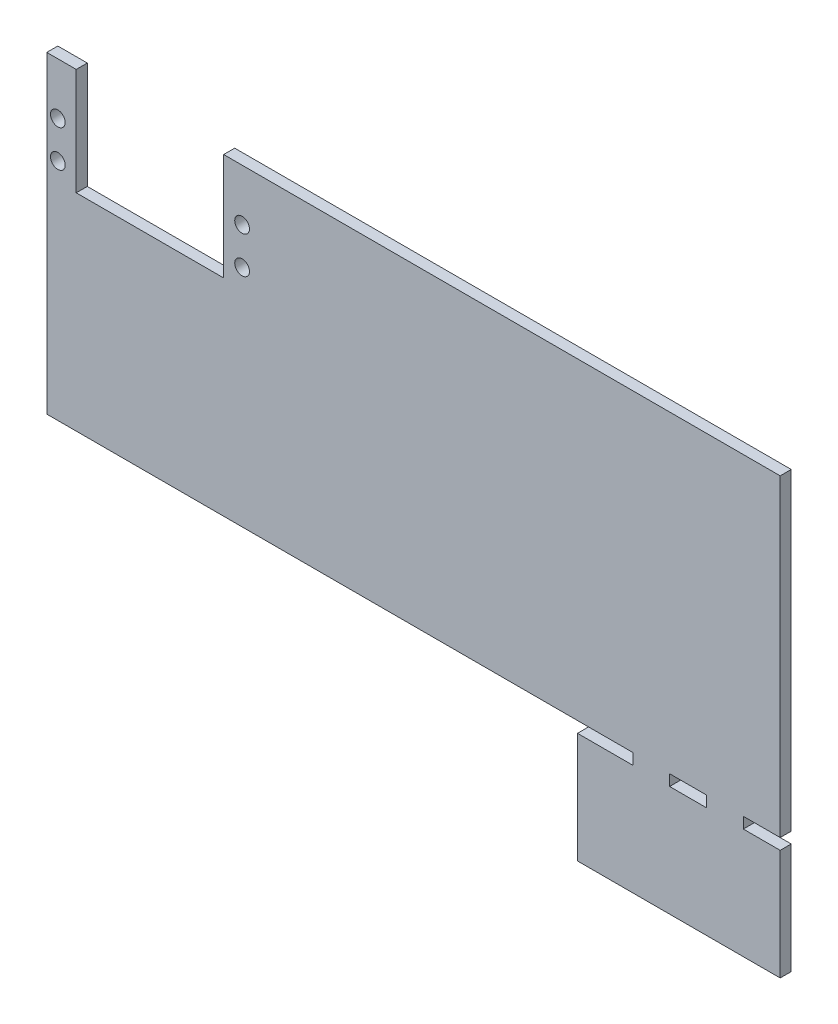
ISO-10303-21;
HEADER;
FILE_DESCRIPTION(('STEP AP214'),'2;1');
FILE_NAME('part.step','',(''),(''),'','','');
FILE_SCHEMA(('AUTOMOTIVE_DESIGN { 1 0 10303 214 1 1 1 1 }'));
ENDSEC;
DATA;
#1=APPLICATION_CONTEXT('core data for automotive mechanical design processes');
#2=APPLICATION_PROTOCOL_DEFINITION('international standard','automotive_design',2000,#1);
#3=PRODUCT_CONTEXT('',#1,'mechanical');
#4=PRODUCT('Part','Part','',(#3));
#5=PRODUCT_RELATED_PRODUCT_CATEGORY('part','',(#4));
#6=PRODUCT_DEFINITION_FORMATION('','',#4);
#7=PRODUCT_DEFINITION_CONTEXT('part definition',#1,'design');
#8=PRODUCT_DEFINITION('design','',#6,#7);
#9=PRODUCT_DEFINITION_SHAPE('','',#8);
#10=(LENGTH_UNIT() NAMED_UNIT(*) SI_UNIT(.MILLI.,.METRE.));
#11=(NAMED_UNIT(*) PLANE_ANGLE_UNIT() SI_UNIT($,.RADIAN.));
#12=(NAMED_UNIT(*) SI_UNIT($,.STERADIAN.) SOLID_ANGLE_UNIT());
#13=UNCERTAINTY_MEASURE_WITH_UNIT(LENGTH_MEASURE(1.E-05),#10,'distance_accuracy_value','');
#14=(GEOMETRIC_REPRESENTATION_CONTEXT(3) GLOBAL_UNCERTAINTY_ASSIGNED_CONTEXT((#13)) GLOBAL_UNIT_ASSIGNED_CONTEXT((#10,
#11,#12)) REPRESENTATION_CONTEXT('',''));
#15=CARTESIAN_POINT('',(0.,0.,0.));
#16=DIRECTION('',(0.,0.,1.));
#17=DIRECTION('',(1.,0.,0.));
#18=AXIS2_PLACEMENT_3D('',#15,#16,#17);
#19=CARTESIAN_POINT('',(27.5,60.5,3.));
#20=DIRECTION('',(0.,1.,0.));
#21=DIRECTION('',(0.,0.,1.));
#22=AXIS2_PLACEMENT_3D('',#19,#20,#21);
#23=PLANE('',#22);
#24=DIRECTION('',(0.,0.,-1.));
#25=VECTOR('',#24,1.);
#26=CARTESIAN_POINT('',(-123.5,60.5,33.));
#27=LINE('',#26,#25);
#28=CARTESIAN_POINT('',(-123.5,60.5,3.));
#29=VERTEX_POINT('',#28);
#30=CARTESIAN_POINT('',(-123.5,60.5,0.));
#31=VERTEX_POINT('',#30);
#32=EDGE_CURVE('E188',#29,#31,#27,.T.);
#33=ORIENTED_EDGE('',*,*,#32,.F.);
#34=DIRECTION('',(1.,0.,0.));
#35=VECTOR('',#34,1.);
#36=CARTESIAN_POINT('',(27.5,60.5,3.));
#37=LINE('',#36,#35);
#38=CARTESIAN_POINT('',(27.5,60.5,3.));
#39=VERTEX_POINT('',#38);
#40=EDGE_CURVE('E195',#29,#39,#37,.T.);
#41=ORIENTED_EDGE('',*,*,#40,.T.);
#42=DIRECTION('',(0.,0.,-1.));
#43=VECTOR('',#42,1.);
#44=CARTESIAN_POINT('',(27.5,60.5,3.));
#45=LINE('',#44,#43);
#46=CARTESIAN_POINT('',(27.5,60.5,0.));
#47=VERTEX_POINT('',#46);
#48=EDGE_CURVE('E202',#39,#47,#45,.T.);
#49=ORIENTED_EDGE('',*,*,#48,.T.);
#50=DIRECTION('',(1.,0.,0.));
#51=VECTOR('',#50,1.);
#52=CARTESIAN_POINT('',(27.5,60.5,0.));
#53=LINE('',#52,#51);
#54=EDGE_CURVE('E196',#31,#47,#53,.T.);
#55=ORIENTED_EDGE('',*,*,#54,.F.);
#56=EDGE_LOOP('',(#33,#41,#49,#55));
#57=FACE_BOUND('',#56,.T.);
#58=ADVANCED_FACE('F33',(#57),#23,.T.);
#59=CARTESIAN_POINT('',(0.,0.,3.));
#60=DIRECTION('',(0.,0.,-1.));
#61=DIRECTION('',(-1.,0.,0.));
#62=AXIS2_PLACEMENT_3D('',#59,#60,#61);
#63=PLANE('',#62);
#64=CARTESIAN_POINT('',(-118.5,36.5,3.));
#65=DIRECTION('',(0.,0.,-1.));
#66=DIRECTION('',(-1.,0.,0.));
#67=AXIS2_PLACEMENT_3D('',#64,#65,#66);
#68=CIRCLE('',#67,2.);
#69=CARTESIAN_POINT('',(-120.5,36.5,3.));
#70=VERTEX_POINT('',#69);
#71=EDGE_CURVE('E426',#70,#70,#68,.T.);
#72=ORIENTED_EDGE('',*,*,#71,.T.);
#73=EDGE_LOOP('',(#72));
#74=FACE_BOUND('',#73,.T.);
#75=CARTESIAN_POINT('',(-168.5,46.5,3.));
#76=DIRECTION('',(0.,0.,-1.));
#77=DIRECTION('',(-1.,0.,0.));
#78=AXIS2_PLACEMENT_3D('',#75,#76,#77);
#79=CIRCLE('',#78,2.);
#80=CARTESIAN_POINT('',(-170.5,46.5,3.));
#81=VERTEX_POINT('',#80);
#82=EDGE_CURVE('E420',#81,#81,#79,.T.);
#83=ORIENTED_EDGE('',*,*,#82,.T.);
#84=EDGE_LOOP('',(#83));
#85=FACE_BOUND('',#84,.T.);
#86=ORIENTED_EDGE('',*,*,#40,.F.);
#87=DIRECTION('',(0.,-1.,0.));
#88=VECTOR('',#87,1.);
#89=CARTESIAN_POINT('',(-123.5,0.,3.));
#90=LINE('',#89,#88);
#91=CARTESIAN_POINT('',(-123.5,31.5,3.));
#92=VERTEX_POINT('',#91);
#93=EDGE_CURVE('E412',#29,#92,#90,.T.);
#94=ORIENTED_EDGE('',*,*,#93,.T.);
#95=DIRECTION('',(-1.,0.,0.));
#96=VECTOR('',#95,1.);
#97=CARTESIAN_POINT('',(0.,31.5,3.));
#98=LINE('',#97,#96);
#99=CARTESIAN_POINT('',(-163.5,31.5,3.));
#100=VERTEX_POINT('',#99);
#101=EDGE_CURVE('E411',#92,#100,#98,.T.);
#102=ORIENTED_EDGE('',*,*,#101,.T.);
#103=DIRECTION('',(0.,-1.,0.));
#104=VECTOR('',#103,1.);
#105=CARTESIAN_POINT('',(-163.5,0.,3.));
#106=LINE('',#105,#104);
#107=CARTESIAN_POINT('',(-163.5,60.5,3.));
#108=VERTEX_POINT('',#107);
#109=EDGE_CURVE('E409',#108,#100,#106,.T.);
#110=ORIENTED_EDGE('',*,*,#109,.F.);
#111=CARTESIAN_POINT('',(-171.5,60.5,3.));
#112=VERTEX_POINT('',#111);
#113=EDGE_CURVE('E187',#112,#108,#37,.T.);
#114=ORIENTED_EDGE('',*,*,#113,.F.);
#115=DIRECTION('',(0.,1.,0.));
#116=VECTOR('',#115,1.);
#117=CARTESIAN_POINT('',(-171.5,-24.5,3.));
#118=LINE('',#117,#116);
#119=CARTESIAN_POINT('',(-171.5,-24.5,3.));
#120=VERTEX_POINT('',#119);
#121=EDGE_CURVE('E207',#120,#112,#118,.T.);
#122=ORIENTED_EDGE('',*,*,#121,.F.);
#123=DIRECTION('',(-1.,0.,0.));
#124=VECTOR('',#123,1.);
#125=CARTESIAN_POINT('',(-12.5,-24.5,3.));
#126=LINE('',#125,#124);
#127=CARTESIAN_POINT('',(-12.5,-24.5,3.));
#128=VERTEX_POINT('',#127);
#129=EDGE_CURVE('E255',#128,#120,#126,.T.);
#130=ORIENTED_EDGE('',*,*,#129,.F.);
#131=DIRECTION('',(0.,-1.,0.));
#132=VECTOR('',#131,1.);
#133=CARTESIAN_POINT('',(-12.5,-24.5,3.));
#134=LINE('',#133,#132);
#135=CARTESIAN_POINT('',(-12.5,-27.5,3.));
#136=VERTEX_POINT('',#135);
#137=EDGE_CURVE('E251',#128,#136,#134,.T.);
#138=ORIENTED_EDGE('',*,*,#137,.T.);
#139=DIRECTION('',(1.,0.,0.));
#140=VECTOR('',#139,1.);
#141=CARTESIAN_POINT('',(-27.5,-27.5,3.));
#142=LINE('',#141,#140);
#143=CARTESIAN_POINT('',(-27.5,-27.5,3.));
#144=VERTEX_POINT('',#143);
#145=EDGE_CURVE('E218',#144,#136,#142,.T.);
#146=ORIENTED_EDGE('',*,*,#145,.F.);
#147=DIRECTION('',(0.,1.,0.));
#148=VECTOR('',#147,1.);
#149=CARTESIAN_POINT('',(-27.5,-57.5,3.));
#150=LINE('',#149,#148);
#151=CARTESIAN_POINT('',(-27.5,-57.5,3.));
#152=VERTEX_POINT('',#151);
#153=EDGE_CURVE('E213',#152,#144,#150,.T.);
#154=ORIENTED_EDGE('',*,*,#153,.F.);
#155=DIRECTION('',(-1.,0.,0.));
#156=VECTOR('',#155,1.);
#157=CARTESIAN_POINT('',(-27.5,-57.5,3.));
#158=LINE('',#157,#156);
#159=CARTESIAN_POINT('',(27.5,-57.5,3.));
#160=VERTEX_POINT('',#159);
#161=EDGE_CURVE('E224',#160,#152,#158,.T.);
#162=ORIENTED_EDGE('',*,*,#161,.F.);
#163=DIRECTION('',(0.,-1.,0.));
#164=VECTOR('',#163,1.);
#165=CARTESIAN_POINT('',(27.5,-57.5,3.));
#166=LINE('',#165,#164);
#167=CARTESIAN_POINT('',(27.5,-27.5,3.));
#168=VERTEX_POINT('',#167);
#169=EDGE_CURVE('E220',#168,#160,#166,.T.);
#170=ORIENTED_EDGE('',*,*,#169,.F.);
#171=CARTESIAN_POINT('',(17.5,-27.5,3.));
#172=VERTEX_POINT('',#171);
#173=EDGE_CURVE('E216',#172,#168,#142,.T.);
#174=ORIENTED_EDGE('',*,*,#173,.F.);
#175=DIRECTION('',(0.,-1.,0.));
#176=VECTOR('',#175,1.);
#177=CARTESIAN_POINT('',(17.5,-24.5,3.));
#178=LINE('',#177,#176);
#179=CARTESIAN_POINT('',(17.5,-24.5,3.));
#180=VERTEX_POINT('',#179);
#181=EDGE_CURVE('E267',#180,#172,#178,.T.);
#182=ORIENTED_EDGE('',*,*,#181,.F.);
#183=DIRECTION('',(-1.,0.,0.));
#184=VECTOR('',#183,1.);
#185=CARTESIAN_POINT('',(27.5,-24.5,3.));
#186=LINE('',#185,#184);
#187=CARTESIAN_POINT('',(27.5,-24.5,3.));
#188=VERTEX_POINT('',#187);
#189=EDGE_CURVE('E297',#188,#180,#186,.T.);
#190=ORIENTED_EDGE('',*,*,#189,.F.);
#191=DIRECTION('',(0.,1.,0.));
#192=VECTOR('',#191,1.);
#193=CARTESIAN_POINT('',(27.5,-27.5,3.));
#194=LINE('',#193,#192);
#195=EDGE_CURVE('E11',#188,#39,#194,.T.);
#196=ORIENTED_EDGE('',*,*,#195,.T.);
#197=EDGE_LOOP('',(#86,#94,#102,#110,#114,#122,#130,#138,#146,#154,#162,#170,#174,#182,#190,#196));
#198=FACE_BOUND('',#197,.T.);
#199=CARTESIAN_POINT('',(-2.50000000000001,-27.5,3.));
#200=VERTEX_POINT('',#199);
#201=CARTESIAN_POINT('',(7.49999999999999,-27.5,3.));
#202=VERTEX_POINT('',#201);
#203=EDGE_CURVE('E221',#200,#202,#142,.T.);
#204=ORIENTED_EDGE('',*,*,#203,.F.);
#205=DIRECTION('',(0.,-1.,0.));
#206=VECTOR('',#205,1.);
#207=CARTESIAN_POINT('',(-2.50000000000001,-24.5,3.));
#208=LINE('',#207,#206);
#209=CARTESIAN_POINT('',(-2.50000000000001,-24.5,3.));
#210=VERTEX_POINT('',#209);
#211=EDGE_CURVE('E257',#210,#200,#208,.T.);
#212=ORIENTED_EDGE('',*,*,#211,.F.);
#213=DIRECTION('',(-1.,0.,0.));
#214=VECTOR('',#213,1.);
#215=CARTESIAN_POINT('',(7.49999999999999,-24.5,3.));
#216=LINE('',#215,#214);
#217=CARTESIAN_POINT('',(7.49999999999999,-24.5,3.));
#218=VERTEX_POINT('',#217);
#219=EDGE_CURVE('E278',#218,#210,#216,.T.);
#220=ORIENTED_EDGE('',*,*,#219,.F.);
#221=DIRECTION('',(0.,-1.,0.));
#222=VECTOR('',#221,1.);
#223=CARTESIAN_POINT('',(7.49999999999999,-24.5,3.));
#224=LINE('',#223,#222);
#225=EDGE_CURVE('E275',#218,#202,#224,.T.);
#226=ORIENTED_EDGE('',*,*,#225,.T.);
#227=EDGE_LOOP('',(#204,#212,#220,#226));
#228=FACE_BOUND('',#227,.T.);
#229=CARTESIAN_POINT('',(-168.5,36.5,3.));
#230=DIRECTION('',(0.,0.,-1.));
#231=DIRECTION('',(-1.,0.,0.));
#232=AXIS2_PLACEMENT_3D('',#229,#230,#231);
#233=CIRCLE('',#232,2.);
#234=CARTESIAN_POINT('',(-170.5,36.5,3.));
#235=VERTEX_POINT('',#234);
#236=EDGE_CURVE('E423',#235,#235,#233,.F.);
#237=ORIENTED_EDGE('',*,*,#236,.F.);
#238=EDGE_LOOP('',(#237));
#239=FACE_BOUND('',#238,.T.);
#240=CARTESIAN_POINT('',(-118.5,46.5,3.));
#241=DIRECTION('',(0.,0.,-1.));
#242=DIRECTION('',(-1.,0.,0.));
#243=AXIS2_PLACEMENT_3D('',#240,#241,#242);
#244=CIRCLE('',#243,2.);
#245=CARTESIAN_POINT('',(-120.5,46.5,3.));
#246=VERTEX_POINT('',#245);
#247=EDGE_CURVE('E199',#246,#246,#244,.F.);
#248=ORIENTED_EDGE('',*,*,#247,.F.);
#249=EDGE_LOOP('',(#248));
#250=FACE_BOUND('',#249,.T.);
#251=ADVANCED_FACE('F320',(#74,#85,#198,#228,#239,#250),#63,.F.);
#252=CARTESIAN_POINT('',(0.,0.,0.));
#253=DIRECTION('',(0.,0.,-1.));
#254=DIRECTION('',(-1.,0.,0.));
#255=AXIS2_PLACEMENT_3D('',#252,#253,#254);
#256=PLANE('',#255);
#257=DIRECTION('',(0.,-1.,0.));
#258=VECTOR('',#257,1.);
#259=CARTESIAN_POINT('',(-123.5,51.5,0.));
#260=LINE('',#259,#258);
#261=CARTESIAN_POINT('',(-123.5,31.5,0.));
#262=VERTEX_POINT('',#261);
#263=EDGE_CURVE('E179',#31,#262,#260,.T.);
#264=ORIENTED_EDGE('',*,*,#263,.F.);
#265=ORIENTED_EDGE('',*,*,#54,.T.);
#266=DIRECTION('',(0.,1.,0.));
#267=VECTOR('',#266,1.);
#268=CARTESIAN_POINT('',(27.5,-27.5,0.));
#269=LINE('',#268,#267);
#270=CARTESIAN_POINT('',(27.5,-24.5,0.));
#271=VERTEX_POINT('',#270);
#272=EDGE_CURVE('E37',#271,#47,#269,.T.);
#273=ORIENTED_EDGE('',*,*,#272,.F.);
#274=DIRECTION('',(-1.,0.,0.));
#275=VECTOR('',#274,1.);
#276=CARTESIAN_POINT('',(27.5,-24.5,0.));
#277=LINE('',#276,#275);
#278=CARTESIAN_POINT('',(17.5,-24.5,0.));
#279=VERTEX_POINT('',#278);
#280=EDGE_CURVE('E296',#271,#279,#277,.T.);
#281=ORIENTED_EDGE('',*,*,#280,.T.);
#282=DIRECTION('',(0.,-1.,0.));
#283=VECTOR('',#282,1.);
#284=CARTESIAN_POINT('',(17.5,-24.5,0.));
#285=LINE('',#284,#283);
#286=CARTESIAN_POINT('',(17.5,-27.5,0.));
#287=VERTEX_POINT('',#286);
#288=EDGE_CURVE('E300',#279,#287,#285,.T.);
#289=ORIENTED_EDGE('',*,*,#288,.T.);
#290=DIRECTION('',(1.,0.,0.));
#291=VECTOR('',#290,1.);
#292=CARTESIAN_POINT('',(-27.5,-27.5,0.));
#293=LINE('',#292,#291);
#294=CARTESIAN_POINT('',(27.5,-27.5,0.));
#295=VERTEX_POINT('',#294);
#296=EDGE_CURVE('E230',#287,#295,#293,.T.);
#297=ORIENTED_EDGE('',*,*,#296,.T.);
#298=DIRECTION('',(0.,-1.,0.));
#299=VECTOR('',#298,1.);
#300=CARTESIAN_POINT('',(27.5,-57.5,0.));
#301=LINE('',#300,#299);
#302=CARTESIAN_POINT('',(27.5,-57.5,0.));
#303=VERTEX_POINT('',#302);
#304=EDGE_CURVE('E234',#295,#303,#301,.T.);
#305=ORIENTED_EDGE('',*,*,#304,.T.);
#306=DIRECTION('',(-1.,0.,0.));
#307=VECTOR('',#306,1.);
#308=CARTESIAN_POINT('',(-27.5,-57.5,0.));
#309=LINE('',#308,#307);
#310=CARTESIAN_POINT('',(-27.5,-57.5,0.));
#311=VERTEX_POINT('',#310);
#312=EDGE_CURVE('E217',#303,#311,#309,.T.);
#313=ORIENTED_EDGE('',*,*,#312,.T.);
#314=DIRECTION('',(0.,1.,0.));
#315=VECTOR('',#314,1.);
#316=CARTESIAN_POINT('',(-27.5,-57.5,0.));
#317=LINE('',#316,#315);
#318=CARTESIAN_POINT('',(-27.5,-27.5,0.));
#319=VERTEX_POINT('',#318);
#320=EDGE_CURVE('E212',#311,#319,#317,.T.);
#321=ORIENTED_EDGE('',*,*,#320,.T.);
#322=CARTESIAN_POINT('',(-12.5,-27.5,0.));
#323=VERTEX_POINT('',#322);
#324=EDGE_CURVE('E231',#319,#323,#293,.T.);
#325=ORIENTED_EDGE('',*,*,#324,.T.);
#326=DIRECTION('',(0.,-1.,0.));
#327=VECTOR('',#326,1.);
#328=CARTESIAN_POINT('',(-12.5,-24.5,0.));
#329=LINE('',#328,#327);
#330=CARTESIAN_POINT('',(-12.5,-24.5,0.));
#331=VERTEX_POINT('',#330);
#332=EDGE_CURVE('E250',#331,#323,#329,.T.);
#333=ORIENTED_EDGE('',*,*,#332,.F.);
#334=DIRECTION('',(-1.,0.,0.));
#335=VECTOR('',#334,1.);
#336=CARTESIAN_POINT('',(-12.5,-24.5,0.));
#337=LINE('',#336,#335);
#338=CARTESIAN_POINT('',(-171.5,-24.5,0.));
#339=VERTEX_POINT('',#338);
#340=EDGE_CURVE('E56',#331,#339,#337,.T.);
#341=ORIENTED_EDGE('',*,*,#340,.T.);
#342=DIRECTION('',(0.,1.,0.));
#343=VECTOR('',#342,1.);
#344=CARTESIAN_POINT('',(-171.5,-24.5,0.));
#345=LINE('',#344,#343);
#346=CARTESIAN_POINT('',(-171.5,60.5,0.));
#347=VERTEX_POINT('',#346);
#348=EDGE_CURVE('E193',#339,#347,#345,.T.);
#349=ORIENTED_EDGE('',*,*,#348,.T.);
#350=CARTESIAN_POINT('',(-163.5,60.5,0.));
#351=VERTEX_POINT('',#350);
#352=EDGE_CURVE('E185',#347,#351,#53,.T.);
#353=ORIENTED_EDGE('',*,*,#352,.T.);
#354=DIRECTION('',(0.,-1.,0.));
#355=VECTOR('',#354,1.);
#356=CARTESIAN_POINT('',(-163.5,51.5,0.));
#357=LINE('',#356,#355);
#358=CARTESIAN_POINT('',(-163.5,31.5,0.));
#359=VERTEX_POINT('',#358);
#360=EDGE_CURVE('E171',#351,#359,#357,.T.);
#361=ORIENTED_EDGE('',*,*,#360,.T.);
#362=DIRECTION('',(-1.,0.,0.));
#363=VECTOR('',#362,1.);
#364=CARTESIAN_POINT('',(-123.5,31.5,0.));
#365=LINE('',#364,#363);
#366=EDGE_CURVE('E48',#262,#359,#365,.T.);
#367=ORIENTED_EDGE('',*,*,#366,.F.);
#368=EDGE_LOOP('',(#264,#265,#273,#281,#289,#297,#305,#313,#321,#325,#333,#341,#349,#353,#361,#367));
#369=FACE_BOUND('',#368,.T.);
#370=CARTESIAN_POINT('',(-168.5,36.5,0.));
#371=DIRECTION('',(0.,0.,1.));
#372=DIRECTION('',(1.,0.,0.));
#373=AXIS2_PLACEMENT_3D('',#370,#371,#372);
#374=CIRCLE('',#373,2.);
#375=CARTESIAN_POINT('',(-166.5,36.5,0.));
#376=VERTEX_POINT('',#375);
#377=EDGE_CURVE('E467',#376,#376,#374,.T.);
#378=ORIENTED_EDGE('',*,*,#377,.T.);
#379=EDGE_LOOP('',(#378));
#380=FACE_BOUND('',#379,.T.);
#381=CARTESIAN_POINT('',(-168.5,46.5,0.));
#382=DIRECTION('',(0.,0.,-1.));
#383=DIRECTION('',(-1.,0.,0.));
#384=AXIS2_PLACEMENT_3D('',#381,#382,#383);
#385=CIRCLE('',#384,2.);
#386=CARTESIAN_POINT('',(-170.5,46.5,0.));
#387=VERTEX_POINT('',#386);
#388=EDGE_CURVE('E463',#387,#387,#385,.T.);
#389=ORIENTED_EDGE('',*,*,#388,.F.);
#390=EDGE_LOOP('',(#389));
#391=FACE_BOUND('',#390,.T.);
#392=DIRECTION('',(0.,-1.,0.));
#393=VECTOR('',#392,1.);
#394=CARTESIAN_POINT('',(-2.50000000000001,-24.5,0.));
#395=LINE('',#394,#393);
#396=CARTESIAN_POINT('',(-2.50000000000001,-24.5,0.));
#397=VERTEX_POINT('',#396);
#398=CARTESIAN_POINT('',(-2.50000000000001,-27.5,0.));
#399=VERTEX_POINT('',#398);
#400=EDGE_CURVE('E279',#397,#399,#395,.T.);
#401=ORIENTED_EDGE('',*,*,#400,.T.);
#402=CARTESIAN_POINT('',(7.49999999999999,-27.5,0.));
#403=VERTEX_POINT('',#402);
#404=EDGE_CURVE('E235',#399,#403,#293,.T.);
#405=ORIENTED_EDGE('',*,*,#404,.T.);
#406=DIRECTION('',(0.,-1.,0.));
#407=VECTOR('',#406,1.);
#408=CARTESIAN_POINT('',(7.49999999999999,-24.5,0.));
#409=LINE('',#408,#407);
#410=CARTESIAN_POINT('',(7.49999999999999,-24.5,0.));
#411=VERTEX_POINT('',#410);
#412=EDGE_CURVE('E274',#411,#403,#409,.T.);
#413=ORIENTED_EDGE('',*,*,#412,.F.);
#414=DIRECTION('',(-1.,0.,0.));
#415=VECTOR('',#414,1.);
#416=CARTESIAN_POINT('',(7.49999999999999,-24.5,0.));
#417=LINE('',#416,#415);
#418=EDGE_CURVE('E286',#411,#397,#417,.T.);
#419=ORIENTED_EDGE('',*,*,#418,.T.);
#420=EDGE_LOOP('',(#401,#405,#413,#419));
#421=FACE_BOUND('',#420,.T.);
#422=CARTESIAN_POINT('',(-118.5,36.5,0.));
#423=DIRECTION('',(0.,0.,-1.));
#424=DIRECTION('',(-1.,0.,0.));
#425=AXIS2_PLACEMENT_3D('',#422,#423,#424);
#426=CIRCLE('',#425,2.);
#427=CARTESIAN_POINT('',(-120.5,36.5,0.));
#428=VERTEX_POINT('',#427);
#429=EDGE_CURVE('E471',#428,#428,#426,.T.);
#430=ORIENTED_EDGE('',*,*,#429,.F.);
#431=EDGE_LOOP('',(#430));
#432=FACE_BOUND('',#431,.T.);
#433=CARTESIAN_POINT('',(-118.5,46.5,0.));
#434=DIRECTION('',(0.,0.,1.));
#435=DIRECTION('',(1.,0.,0.));
#436=AXIS2_PLACEMENT_3D('',#433,#434,#435);
#437=CIRCLE('',#436,2.);
#438=CARTESIAN_POINT('',(-116.5,46.5,0.));
#439=VERTEX_POINT('',#438);
#440=EDGE_CURVE('E477',#439,#439,#437,.T.);
#441=ORIENTED_EDGE('',*,*,#440,.T.);
#442=EDGE_LOOP('',(#441));
#443=FACE_BOUND('',#442,.T.);
#444=ADVANCED_FACE('F190',(#369,#380,#391,#421,#432,#443),#256,.T.);
#445=CARTESIAN_POINT('',(27.5,-27.5,3.));
#446=DIRECTION('',(-1.,0.,0.));
#447=DIRECTION('',(0.,0.,1.));
#448=AXIS2_PLACEMENT_3D('',#445,#446,#447);
#449=PLANE('',#448);
#450=ORIENTED_EDGE('',*,*,#195,.F.);
#451=DIRECTION('',(0.,0.,1.));
#452=VECTOR('',#451,1.);
#453=CARTESIAN_POINT('',(27.5,-24.5,0.));
#454=LINE('',#453,#452);
#455=EDGE_CURVE('E294',#271,#188,#454,.T.);
#456=ORIENTED_EDGE('',*,*,#455,.F.);
#457=ORIENTED_EDGE('',*,*,#272,.T.);
#458=ORIENTED_EDGE('',*,*,#48,.F.);
#459=EDGE_LOOP('',(#450,#456,#457,#458));
#460=FACE_BOUND('',#459,.T.);
#461=ADVANCED_FACE('F35',(#460),#449,.F.);
#462=CARTESIAN_POINT('',(17.5,-24.5,0.));
#463=DIRECTION('',(-1.,0.,0.));
#464=DIRECTION('',(0.,0.,1.));
#465=AXIS2_PLACEMENT_3D('',#462,#463,#464);
#466=PLANE('',#465);
#467=ORIENTED_EDGE('',*,*,#181,.T.);
#468=DIRECTION('',(0.,0.,1.));
#469=VECTOR('',#468,1.);
#470=CARTESIAN_POINT('',(17.5,-27.5,0.));
#471=LINE('',#470,#469);
#472=EDGE_CURVE('E242',#287,#172,#471,.T.);
#473=ORIENTED_EDGE('',*,*,#472,.F.);
#474=ORIENTED_EDGE('',*,*,#288,.F.);
#475=DIRECTION('',(0.,0.,1.));
#476=VECTOR('',#475,1.);
#477=CARTESIAN_POINT('',(17.5,-24.5,0.));
#478=LINE('',#477,#476);
#479=EDGE_CURVE('E292',#279,#180,#478,.T.);
#480=ORIENTED_EDGE('',*,*,#479,.T.);
#481=EDGE_LOOP('',(#467,#473,#474,#480));
#482=FACE_BOUND('',#481,.T.);
#483=ADVANCED_FACE('F310',(#482),#466,.F.);
#484=CARTESIAN_POINT('',(27.5,-24.5,0.));
#485=DIRECTION('',(0.,1.,0.));
#486=DIRECTION('',(0.,0.,1.));
#487=AXIS2_PLACEMENT_3D('',#484,#485,#486);
#488=PLANE('',#487);
#489=ORIENTED_EDGE('',*,*,#189,.T.);
#490=ORIENTED_EDGE('',*,*,#479,.F.);
#491=ORIENTED_EDGE('',*,*,#280,.F.);
#492=ORIENTED_EDGE('',*,*,#455,.T.);
#493=EDGE_LOOP('',(#489,#490,#491,#492));
#494=FACE_BOUND('',#493,.T.);
#495=ADVANCED_FACE('F312',(#494),#488,.F.);
#496=CARTESIAN_POINT('',(-2.50000000000001,-24.5,0.));
#497=DIRECTION('',(-1.,0.,0.));
#498=DIRECTION('',(0.,-1.,0.));
#499=AXIS2_PLACEMENT_3D('',#496,#497,#498);
#500=PLANE('',#499);
#501=ORIENTED_EDGE('',*,*,#211,.T.);
#502=DIRECTION('',(0.,0.,1.));
#503=VECTOR('',#502,1.);
#504=CARTESIAN_POINT('',(-2.50000000000001,-27.5,0.));
#505=LINE('',#504,#503);
#506=EDGE_CURVE('E264',#399,#200,#505,.T.);
#507=ORIENTED_EDGE('',*,*,#506,.F.);
#508=ORIENTED_EDGE('',*,*,#400,.F.);
#509=DIRECTION('',(0.,0.,1.));
#510=VECTOR('',#509,1.);
#511=CARTESIAN_POINT('',(-2.50000000000001,-24.5,0.));
#512=LINE('',#511,#510);
#513=EDGE_CURVE('E266',#397,#210,#512,.T.);
#514=ORIENTED_EDGE('',*,*,#513,.T.);
#515=EDGE_LOOP('',(#501,#507,#508,#514));
#516=FACE_BOUND('',#515,.T.);
#517=ADVANCED_FACE('F345',(#516),#500,.F.);
#518=CARTESIAN_POINT('',(7.49999999999999,-24.5,0.));
#519=DIRECTION('',(0.,1.,0.));
#520=DIRECTION('',(0.,0.,1.));
#521=AXIS2_PLACEMENT_3D('',#518,#519,#520);
#522=PLANE('',#521);
#523=ORIENTED_EDGE('',*,*,#219,.T.);
#524=ORIENTED_EDGE('',*,*,#513,.F.);
#525=ORIENTED_EDGE('',*,*,#418,.F.);
#526=DIRECTION('',(0.,0.,1.));
#527=VECTOR('',#526,1.);
#528=CARTESIAN_POINT('',(7.49999999999999,-24.5,0.));
#529=LINE('',#528,#527);
#530=EDGE_CURVE('E269',#411,#218,#529,.T.);
#531=ORIENTED_EDGE('',*,*,#530,.T.);
#532=EDGE_LOOP('',(#523,#524,#525,#531));
#533=FACE_BOUND('',#532,.T.);
#534=ADVANCED_FACE('F340',(#533),#522,.F.);
#535=CARTESIAN_POINT('',(7.49999999999999,-24.5,0.));
#536=DIRECTION('',(-1.,0.,0.));
#537=DIRECTION('',(0.,0.,1.));
#538=AXIS2_PLACEMENT_3D('',#535,#536,#537);
#539=PLANE('',#538);
#540=ORIENTED_EDGE('',*,*,#225,.F.);
#541=ORIENTED_EDGE('',*,*,#530,.F.);
#542=ORIENTED_EDGE('',*,*,#412,.T.);
#543=DIRECTION('',(0.,0.,1.));
#544=VECTOR('',#543,1.);
#545=CARTESIAN_POINT('',(7.49999999999999,-27.5,0.));
#546=LINE('',#545,#544);
#547=EDGE_CURVE('E271',#403,#202,#546,.T.);
#548=ORIENTED_EDGE('',*,*,#547,.T.);
#549=EDGE_LOOP('',(#540,#541,#542,#548));
#550=FACE_BOUND('',#549,.T.);
#551=ADVANCED_FACE('F334',(#550),#539,.T.);
#552=CARTESIAN_POINT('',(-12.5,-24.5,0.));
#553=DIRECTION('',(0.,1.,0.));
#554=DIRECTION('',(0.,0.,1.));
#555=AXIS2_PLACEMENT_3D('',#552,#553,#554);
#556=PLANE('',#555);
#557=ORIENTED_EDGE('',*,*,#129,.T.);
#558=DIRECTION('',(0.,0.,-1.));
#559=VECTOR('',#558,1.);
#560=CARTESIAN_POINT('',(-171.5,-24.5,3.));
#561=LINE('',#560,#559);
#562=EDGE_CURVE('E209',#120,#339,#561,.T.);
#563=ORIENTED_EDGE('',*,*,#562,.T.);
#564=ORIENTED_EDGE('',*,*,#340,.F.);
#565=DIRECTION('',(0.,0.,1.));
#566=VECTOR('',#565,1.);
#567=CARTESIAN_POINT('',(-12.5,-24.5,0.));
#568=LINE('',#567,#566);
#569=EDGE_CURVE('E262',#331,#128,#568,.T.);
#570=ORIENTED_EDGE('',*,*,#569,.T.);
#571=EDGE_LOOP('',(#557,#563,#564,#570));
#572=FACE_BOUND('',#571,.T.);
#573=ADVANCED_FACE('F397',(#572),#556,.F.);
#574=CARTESIAN_POINT('',(-12.5,-24.5,0.));
#575=DIRECTION('',(-1.,0.,0.));
#576=DIRECTION('',(0.,0.,1.));
#577=AXIS2_PLACEMENT_3D('',#574,#575,#576);
#578=PLANE('',#577);
#579=ORIENTED_EDGE('',*,*,#137,.F.);
#580=ORIENTED_EDGE('',*,*,#569,.F.);
#581=ORIENTED_EDGE('',*,*,#332,.T.);
#582=DIRECTION('',(0.,0.,1.));
#583=VECTOR('',#582,1.);
#584=CARTESIAN_POINT('',(-12.5,-27.5,0.));
#585=LINE('',#584,#583);
#586=EDGE_CURVE('E254',#323,#136,#585,.T.);
#587=ORIENTED_EDGE('',*,*,#586,.T.);
#588=EDGE_LOOP('',(#579,#580,#581,#587));
#589=FACE_BOUND('',#588,.T.);
#590=ADVANCED_FACE('F395',(#589),#578,.T.);
#591=CARTESIAN_POINT('',(-27.5,-27.5,3.));
#592=DIRECTION('',(0.,1.,0.));
#593=DIRECTION('',(0.,0.,1.));
#594=AXIS2_PLACEMENT_3D('',#591,#592,#593);
#595=PLANE('',#594);
#596=ORIENTED_EDGE('',*,*,#472,.T.);
#597=ORIENTED_EDGE('',*,*,#173,.T.);
#598=DIRECTION('',(0.,0.,-1.));
#599=VECTOR('',#598,1.);
#600=CARTESIAN_POINT('',(27.5,-27.5,3.));
#601=LINE('',#600,#599);
#602=EDGE_CURVE('E245',#168,#295,#601,.T.);
#603=ORIENTED_EDGE('',*,*,#602,.T.);
#604=ORIENTED_EDGE('',*,*,#296,.F.);
#605=EDGE_LOOP('',(#596,#597,#603,#604));
#606=FACE_BOUND('',#605,.T.);
#607=ADVANCED_FACE('F382',(#606),#595,.T.);
#608=ORIENTED_EDGE('',*,*,#506,.T.);
#609=ORIENTED_EDGE('',*,*,#203,.T.);
#610=ORIENTED_EDGE('',*,*,#547,.F.);
#611=ORIENTED_EDGE('',*,*,#404,.F.);
#612=EDGE_LOOP('',(#608,#609,#610,#611));
#613=FACE_BOUND('',#612,.T.);
#614=ADVANCED_FACE('F328',(#613),#595,.T.);
#615=CARTESIAN_POINT('',(-27.5,-57.5,3.));
#616=DIRECTION('',(-1.,0.,0.));
#617=DIRECTION('',(0.,0.,1.));
#618=AXIS2_PLACEMENT_3D('',#615,#616,#617);
#619=PLANE('',#618);
#620=ORIENTED_EDGE('',*,*,#320,.F.);
#621=DIRECTION('',(0.,0.,-1.));
#622=VECTOR('',#621,1.);
#623=CARTESIAN_POINT('',(-27.5,-57.5,3.));
#624=LINE('',#623,#622);
#625=EDGE_CURVE('E240',#152,#311,#624,.T.);
#626=ORIENTED_EDGE('',*,*,#625,.F.);
#627=ORIENTED_EDGE('',*,*,#153,.T.);
#628=DIRECTION('',(0.,0.,-1.));
#629=VECTOR('',#628,1.);
#630=CARTESIAN_POINT('',(-27.5,-27.5,3.));
#631=LINE('',#630,#629);
#632=EDGE_CURVE('E227',#144,#319,#631,.T.);
#633=ORIENTED_EDGE('',*,*,#632,.T.);
#634=EDGE_LOOP('',(#620,#626,#627,#633));
#635=FACE_BOUND('',#634,.T.);
#636=ADVANCED_FACE('F387',(#635),#619,.T.);
#637=CARTESIAN_POINT('',(-27.5,-57.5,3.));
#638=DIRECTION('',(0.,-1.,0.));
#639=DIRECTION('',(1.,0.,0.));
#640=AXIS2_PLACEMENT_3D('',#637,#638,#639);
#641=PLANE('',#640);
#642=ORIENTED_EDGE('',*,*,#312,.F.);
#643=DIRECTION('',(0.,0.,-1.));
#644=VECTOR('',#643,1.);
#645=CARTESIAN_POINT('',(27.5,-57.5,3.));
#646=LINE('',#645,#644);
#647=EDGE_CURVE('E243',#160,#303,#646,.T.);
#648=ORIENTED_EDGE('',*,*,#647,.F.);
#649=ORIENTED_EDGE('',*,*,#161,.T.);
#650=ORIENTED_EDGE('',*,*,#625,.T.);
#651=EDGE_LOOP('',(#642,#648,#649,#650));
#652=FACE_BOUND('',#651,.T.);
#653=ADVANCED_FACE('F384',(#652),#641,.T.);
#654=CARTESIAN_POINT('',(27.5,-57.5,3.));
#655=DIRECTION('',(1.,0.,0.));
#656=DIRECTION('',(0.,1.,0.));
#657=AXIS2_PLACEMENT_3D('',#654,#655,#656);
#658=PLANE('',#657);
#659=ORIENTED_EDGE('',*,*,#304,.F.);
#660=ORIENTED_EDGE('',*,*,#602,.F.);
#661=ORIENTED_EDGE('',*,*,#169,.T.);
#662=ORIENTED_EDGE('',*,*,#647,.T.);
#663=EDGE_LOOP('',(#659,#660,#661,#662));
#664=FACE_BOUND('',#663,.T.);
#665=ADVANCED_FACE('F379',(#664),#658,.T.);
#666=ORIENTED_EDGE('',*,*,#145,.T.);
#667=ORIENTED_EDGE('',*,*,#586,.F.);
#668=ORIENTED_EDGE('',*,*,#324,.F.);
#669=ORIENTED_EDGE('',*,*,#632,.F.);
#670=EDGE_LOOP('',(#666,#667,#668,#669));
#671=FACE_BOUND('',#670,.T.);
#672=ADVANCED_FACE('F374',(#671),#595,.T.);
#673=CARTESIAN_POINT('',(-171.5,-24.5,3.));
#674=DIRECTION('',(-1.,0.,0.));
#675=DIRECTION('',(0.,0.,1.));
#676=AXIS2_PLACEMENT_3D('',#673,#674,#675);
#677=PLANE('',#676);
#678=ORIENTED_EDGE('',*,*,#348,.F.);
#679=ORIENTED_EDGE('',*,*,#562,.F.);
#680=ORIENTED_EDGE('',*,*,#121,.T.);
#681=DIRECTION('',(0.,0.,-1.));
#682=VECTOR('',#681,1.);
#683=CARTESIAN_POINT('',(-171.5,60.5,3.));
#684=LINE('',#683,#682);
#685=EDGE_CURVE('E205',#112,#347,#684,.T.);
#686=ORIENTED_EDGE('',*,*,#685,.T.);
#687=EDGE_LOOP('',(#678,#679,#680,#686));
#688=FACE_BOUND('',#687,.T.);
#689=ADVANCED_FACE('F368',(#688),#677,.T.);
#690=DIRECTION('',(0.,0.,-1.));
#691=VECTOR('',#690,1.);
#692=CARTESIAN_POINT('',(-163.5,60.5,33.));
#693=LINE('',#692,#691);
#694=EDGE_CURVE('E174',#108,#351,#693,.T.);
#695=ORIENTED_EDGE('',*,*,#694,.T.);
#696=ORIENTED_EDGE('',*,*,#352,.F.);
#697=ORIENTED_EDGE('',*,*,#685,.F.);
#698=ORIENTED_EDGE('',*,*,#113,.T.);
#699=EDGE_LOOP('',(#695,#696,#697,#698));
#700=FACE_BOUND('',#699,.T.);
#701=ADVANCED_FACE('F183',(#700),#23,.T.);
#702=CARTESIAN_POINT('',(-123.5,31.5,33.));
#703=DIRECTION('',(0.,-1.,0.));
#704=DIRECTION('',(0.,0.,-1.));
#705=AXIS2_PLACEMENT_3D('',#702,#703,#704);
#706=PLANE('',#705);
#707=DIRECTION('',(0.,0.,-1.));
#708=VECTOR('',#707,1.);
#709=CARTESIAN_POINT('',(-123.5,31.5,33.));
#710=LINE('',#709,#708);
#711=EDGE_CURVE('E413',#92,#262,#710,.T.);
#712=ORIENTED_EDGE('',*,*,#711,.T.);
#713=ORIENTED_EDGE('',*,*,#366,.T.);
#714=DIRECTION('',(0.,0.,-1.));
#715=VECTOR('',#714,1.);
#716=CARTESIAN_POINT('',(-163.5,31.5,33.));
#717=LINE('',#716,#715);
#718=EDGE_CURVE('E176',#100,#359,#717,.T.);
#719=ORIENTED_EDGE('',*,*,#718,.F.);
#720=ORIENTED_EDGE('',*,*,#101,.F.);
#721=EDGE_LOOP('',(#712,#713,#719,#720));
#722=FACE_BOUND('',#721,.T.);
#723=ADVANCED_FACE('F367',(#722),#706,.F.);
#724=CARTESIAN_POINT('',(-123.5,51.5,33.));
#725=DIRECTION('',(1.,0.,0.));
#726=DIRECTION('',(0.,1.,0.));
#727=AXIS2_PLACEMENT_3D('',#724,#725,#726);
#728=PLANE('',#727);
#729=ORIENTED_EDGE('',*,*,#93,.F.);
#730=ORIENTED_EDGE('',*,*,#32,.T.);
#731=ORIENTED_EDGE('',*,*,#263,.T.);
#732=ORIENTED_EDGE('',*,*,#711,.F.);
#733=EDGE_LOOP('',(#729,#730,#731,#732));
#734=FACE_BOUND('',#733,.T.);
#735=ADVANCED_FACE('F373',(#734),#728,.F.);
#736=CARTESIAN_POINT('',(-163.5,51.5,33.));
#737=DIRECTION('',(1.,0.,0.));
#738=DIRECTION('',(0.,0.,-1.));
#739=AXIS2_PLACEMENT_3D('',#736,#737,#738);
#740=PLANE('',#739);
#741=ORIENTED_EDGE('',*,*,#109,.T.);
#742=ORIENTED_EDGE('',*,*,#718,.T.);
#743=ORIENTED_EDGE('',*,*,#360,.F.);
#744=ORIENTED_EDGE('',*,*,#694,.F.);
#745=EDGE_LOOP('',(#741,#742,#743,#744));
#746=FACE_BOUND('',#745,.T.);
#747=ADVANCED_FACE('F173',(#746),#740,.T.);
#748=CARTESIAN_POINT('',(-168.5,46.5,33.));
#749=DIRECTION('',(0.,0.,-1.));
#750=DIRECTION('',(-1.,0.,0.));
#751=AXIS2_PLACEMENT_3D('',#748,#749,#750);
#752=CYLINDRICAL_SURFACE('',#751,2.);
#753=ORIENTED_EDGE('',*,*,#388,.T.);
#754=EDGE_LOOP('',(#753));
#755=FACE_BOUND('',#754,.T.);
#756=ORIENTED_EDGE('',*,*,#82,.F.);
#757=EDGE_LOOP('',(#756));
#758=FACE_BOUND('',#757,.T.);
#759=ADVANCED_FACE('F450',(#755,#758),#752,.F.);
#760=CARTESIAN_POINT('',(-168.5,36.5,33.));
#761=DIRECTION('',(0.,0.,-1.));
#762=DIRECTION('',(-1.,0.,0.));
#763=AXIS2_PLACEMENT_3D('',#760,#761,#762);
#764=CYLINDRICAL_SURFACE('',#763,2.);
#765=ORIENTED_EDGE('',*,*,#377,.F.);
#766=EDGE_LOOP('',(#765));
#767=FACE_BOUND('',#766,.T.);
#768=ORIENTED_EDGE('',*,*,#236,.T.);
#769=EDGE_LOOP('',(#768));
#770=FACE_BOUND('',#769,.T.);
#771=ADVANCED_FACE('F440',(#767,#770),#764,.F.);
#772=CARTESIAN_POINT('',(-118.5,36.5,33.));
#773=DIRECTION('',(0.,0.,-1.));
#774=DIRECTION('',(-1.,0.,0.));
#775=AXIS2_PLACEMENT_3D('',#772,#773,#774);
#776=CYLINDRICAL_SURFACE('',#775,2.);
#777=ORIENTED_EDGE('',*,*,#429,.T.);
#778=EDGE_LOOP('',(#777));
#779=FACE_BOUND('',#778,.T.);
#780=ORIENTED_EDGE('',*,*,#71,.F.);
#781=EDGE_LOOP('',(#780));
#782=FACE_BOUND('',#781,.T.);
#783=ADVANCED_FACE('F434',(#779,#782),#776,.F.);
#784=CARTESIAN_POINT('',(-118.5,46.5,33.));
#785=DIRECTION('',(0.,0.,-1.));
#786=DIRECTION('',(-1.,0.,0.));
#787=AXIS2_PLACEMENT_3D('',#784,#785,#786);
#788=CYLINDRICAL_SURFACE('',#787,2.);
#789=ORIENTED_EDGE('',*,*,#440,.F.);
#790=EDGE_LOOP('',(#789));
#791=FACE_BOUND('',#790,.T.);
#792=ORIENTED_EDGE('',*,*,#247,.T.);
#793=EDGE_LOOP('',(#792));
#794=FACE_BOUND('',#793,.T.);
#795=ADVANCED_FACE('F431',(#791,#794),#788,.F.);
#796=CLOSED_SHELL('',(#58,#251,#444,#461,#483,#495,#517,#534,#551,#573,#590,#607,#614,#636,#653,
#665,#672,#689,#701,#723,#735,#747,#759,#771,#783,#795));
#797=MANIFOLD_SOLID_BREP('B2',#796);
#798=ADVANCED_BREP_SHAPE_REPRESENTATION('',(#18,#797),#14);
#799=SHAPE_DEFINITION_REPRESENTATION(#9,#798);
ENDSEC;
END-ISO-10303-21;
